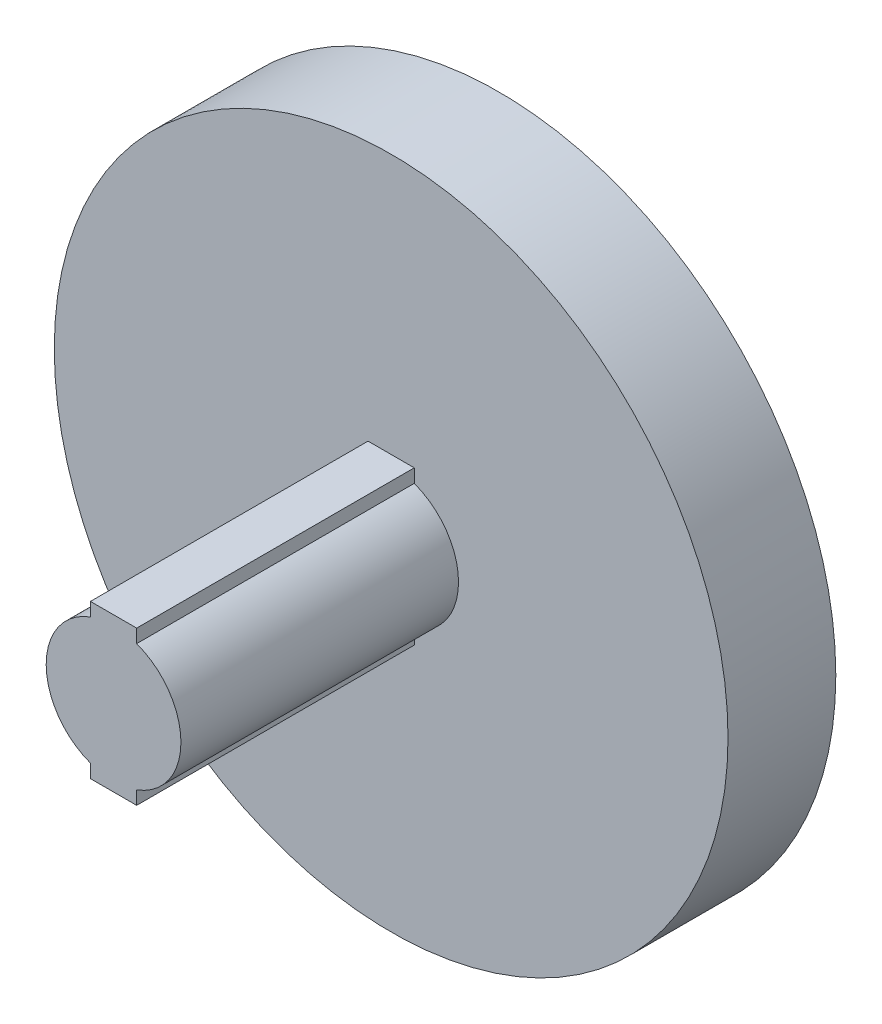
ISO-10303-21;
HEADER;
FILE_DESCRIPTION(('STEP AP214'),'2;1');
FILE_NAME('part.step','',(''),(''),'','','');
FILE_SCHEMA(('AUTOMOTIVE_DESIGN { 1 0 10303 214 1 1 1 1 }'));
ENDSEC;
DATA;
#1=APPLICATION_CONTEXT('core data for automotive mechanical design processes');
#2=APPLICATION_PROTOCOL_DEFINITION('international standard','automotive_design',2000,#1);
#3=PRODUCT_CONTEXT('',#1,'mechanical');
#4=PRODUCT('Part','Part','',(#3));
#5=PRODUCT_RELATED_PRODUCT_CATEGORY('part','',(#4));
#6=PRODUCT_DEFINITION_FORMATION('','',#4);
#7=PRODUCT_DEFINITION_CONTEXT('part definition',#1,'design');
#8=PRODUCT_DEFINITION('design','',#6,#7);
#9=PRODUCT_DEFINITION_SHAPE('','',#8);
#10=(LENGTH_UNIT() NAMED_UNIT(*) SI_UNIT(.MILLI.,.METRE.));
#11=(NAMED_UNIT(*) PLANE_ANGLE_UNIT() SI_UNIT($,.RADIAN.));
#12=(NAMED_UNIT(*) SI_UNIT($,.STERADIAN.) SOLID_ANGLE_UNIT());
#13=UNCERTAINTY_MEASURE_WITH_UNIT(LENGTH_MEASURE(1.E-05),#10,'distance_accuracy_value','');
#14=(GEOMETRIC_REPRESENTATION_CONTEXT(3) GLOBAL_UNCERTAINTY_ASSIGNED_CONTEXT((#13)) GLOBAL_UNIT_ASSIGNED_CONTEXT((#10,
#11,#12)) REPRESENTATION_CONTEXT('',''));
#15=CARTESIAN_POINT('',(0.,0.,0.));
#16=DIRECTION('',(0.,0.,1.));
#17=DIRECTION('',(1.,0.,0.));
#18=AXIS2_PLACEMENT_3D('',#15,#16,#17);
#19=CARTESIAN_POINT('',(0.,0.,8.));
#20=DIRECTION('',(0.,0.,-1.));
#21=DIRECTION('',(-1.,0.,0.));
#22=AXIS2_PLACEMENT_3D('',#19,#20,#21);
#23=CYLINDRICAL_SURFACE('',#22,25.);
#24=CARTESIAN_POINT('',(0.,0.,8.));
#25=DIRECTION('',(0.,0.,1.));
#26=DIRECTION('',(1.,0.,0.));
#27=AXIS2_PLACEMENT_3D('',#24,#25,#26);
#28=CIRCLE('',#27,25.);
#29=CARTESIAN_POINT('',(25.,0.,8.));
#30=VERTEX_POINT('',#29);
#31=EDGE_CURVE('E11',#30,#30,#28,.T.);
#32=ORIENTED_EDGE('',*,*,#31,.F.);
#33=EDGE_LOOP('',(#32));
#34=FACE_BOUND('',#33,.T.);
#35=CARTESIAN_POINT('',(0.,0.,0.));
#36=DIRECTION('',(0.,0.,1.));
#37=DIRECTION('',(1.,0.,0.));
#38=AXIS2_PLACEMENT_3D('',#35,#36,#37);
#39=CIRCLE('',#38,25.);
#40=CARTESIAN_POINT('',(25.,0.,0.));
#41=VERTEX_POINT('',#40);
#42=EDGE_CURVE('E50',#41,#41,#39,.T.);
#43=ORIENTED_EDGE('',*,*,#42,.T.);
#44=EDGE_LOOP('',(#43));
#45=FACE_BOUND('',#44,.T.);
#46=ADVANCED_FACE('F47',(#34,#45),#23,.T.);
#47=CARTESIAN_POINT('',(0.,0.,8.));
#48=DIRECTION('',(0.,0.,1.));
#49=DIRECTION('',(1.,0.,0.));
#50=AXIS2_PLACEMENT_3D('',#47,#48,#49);
#51=PLANE('',#50);
#52=DIRECTION('',(0.,1.,0.));
#53=VECTOR('',#52,1.);
#54=CARTESIAN_POINT('',(1.71514380093522,-5.69662450512211,8.));
#55=LINE('',#54,#53);
#56=CARTESIAN_POINT('',(1.71514380093522,-5.69662450512211,8.));
#57=VERTEX_POINT('',#56);
#58=CARTESIAN_POINT('',(1.71514380093521,-4.69662450512211,8.));
#59=VERTEX_POINT('',#58);
#60=EDGE_CURVE('E62',#57,#59,#55,.T.);
#61=ORIENTED_EDGE('',*,*,#60,.F.);
#62=DIRECTION('',(1.,0.,0.));
#63=VECTOR('',#62,1.);
#64=CARTESIAN_POINT('',(-1.71514380093522,-5.69662450512211,8.));
#65=LINE('',#64,#63);
#66=CARTESIAN_POINT('',(-1.71514380093522,-5.69662450512211,8.));
#67=VERTEX_POINT('',#66);
#68=EDGE_CURVE('E66',#67,#57,#65,.T.);
#69=ORIENTED_EDGE('',*,*,#68,.F.);
#70=DIRECTION('',(0.,1.,0.));
#71=VECTOR('',#70,1.);
#72=CARTESIAN_POINT('',(-1.71514380093522,-5.69662450512211,8.));
#73=LINE('',#72,#71);
#74=CARTESIAN_POINT('',(-1.71514380093522,-4.69662450512211,8.));
#75=VERTEX_POINT('',#74);
#76=EDGE_CURVE('E166',#67,#75,#73,.T.);
#77=ORIENTED_EDGE('',*,*,#76,.T.);
#78=CARTESIAN_POINT('',(0.,0.,8.));
#79=DIRECTION('',(0.,0.,1.));
#80=DIRECTION('',(1.,0.,0.));
#81=AXIS2_PLACEMENT_3D('',#78,#79,#80);
#82=CIRCLE('',#81,5.);
#83=CARTESIAN_POINT('',(-1.71514380093522,4.69662450512211,8.));
#84=VERTEX_POINT('',#83);
#85=EDGE_CURVE('E169',#84,#75,#82,.T.);
#86=ORIENTED_EDGE('',*,*,#85,.F.);
#87=DIRECTION('',(0.,1.,0.));
#88=VECTOR('',#87,1.);
#89=CARTESIAN_POINT('',(-1.71514380093522,4.69662450512211,8.));
#90=LINE('',#89,#88);
#91=CARTESIAN_POINT('',(-1.71514380093522,5.69662450512211,8.));
#92=VERTEX_POINT('',#91);
#93=EDGE_CURVE('E173',#84,#92,#90,.T.);
#94=ORIENTED_EDGE('',*,*,#93,.T.);
#95=DIRECTION('',(1.,0.,0.));
#96=VECTOR('',#95,1.);
#97=CARTESIAN_POINT('',(-1.71514380093522,5.69662450512211,8.));
#98=LINE('',#97,#96);
#99=CARTESIAN_POINT('',(1.71514380093522,5.69662450512211,8.));
#100=VERTEX_POINT('',#99);
#101=EDGE_CURVE('E176',#92,#100,#98,.T.);
#102=ORIENTED_EDGE('',*,*,#101,.T.);
#103=DIRECTION('',(0.,1.,0.));
#104=VECTOR('',#103,1.);
#105=CARTESIAN_POINT('',(1.71514380093522,4.69662450512211,8.));
#106=LINE('',#105,#104);
#107=CARTESIAN_POINT('',(1.71514380093521,4.69662450512211,8.));
#108=VERTEX_POINT('',#107);
#109=EDGE_CURVE('E179',#108,#100,#106,.T.);
#110=ORIENTED_EDGE('',*,*,#109,.F.);
#111=CARTESIAN_POINT('',(0.,0.,8.));
#112=DIRECTION('',(0.,0.,1.));
#113=DIRECTION('',(1.,0.,0.));
#114=AXIS2_PLACEMENT_3D('',#111,#112,#113);
#115=CIRCLE('',#114,5.);
#116=EDGE_CURVE('E183',#59,#108,#115,.T.);
#117=ORIENTED_EDGE('',*,*,#116,.F.);
#118=EDGE_LOOP('',(#61,#69,#77,#86,#94,#102,#110,#117));
#119=FACE_BOUND('',#118,.T.);
#120=ORIENTED_EDGE('',*,*,#31,.T.);
#121=EDGE_LOOP('',(#120));
#122=FACE_BOUND('',#121,.T.);
#123=ADVANCED_FACE('F235',(#119,#122),#51,.T.);
#124=CARTESIAN_POINT('',(0.,0.,0.));
#125=DIRECTION('',(0.,0.,1.));
#126=DIRECTION('',(1.,0.,0.));
#127=AXIS2_PLACEMENT_3D('',#124,#125,#126);
#128=PLANE('',#127);
#129=ORIENTED_EDGE('',*,*,#42,.F.);
#130=EDGE_LOOP('',(#129));
#131=FACE_BOUND('',#130,.T.);
#132=ADVANCED_FACE('F241',(#131),#128,.F.);
#133=CARTESIAN_POINT('',(1.71514380093522,-5.69662450512211,28.6));
#134=DIRECTION('',(-1.,0.,0.));
#135=DIRECTION('',(0.,0.,1.));
#136=AXIS2_PLACEMENT_3D('',#133,#134,#135);
#137=PLANE('',#136);
#138=ORIENTED_EDGE('',*,*,#60,.T.);
#139=DIRECTION('',(0.,0.,-1.));
#140=VECTOR('',#139,1.);
#141=CARTESIAN_POINT('',(1.71514380093521,-4.69662450512211,28.6));
#142=LINE('',#141,#140);
#143=CARTESIAN_POINT('',(1.71514380093521,-4.69662450512211,28.6));
#144=VERTEX_POINT('',#143);
#145=EDGE_CURVE('E115',#144,#59,#142,.T.);
#146=ORIENTED_EDGE('',*,*,#145,.F.);
#147=DIRECTION('',(0.,1.,0.));
#148=VECTOR('',#147,1.);
#149=CARTESIAN_POINT('',(1.71514380093522,-5.69662450512211,28.6));
#150=LINE('',#149,#148);
#151=CARTESIAN_POINT('',(1.71514380093522,-5.69662450512211,28.6));
#152=VERTEX_POINT('',#151);
#153=EDGE_CURVE('E122',#152,#144,#150,.T.);
#154=ORIENTED_EDGE('',*,*,#153,.F.);
#155=DIRECTION('',(0.,0.,-1.));
#156=VECTOR('',#155,1.);
#157=CARTESIAN_POINT('',(1.71514380093522,-5.69662450512211,28.6));
#158=LINE('',#157,#156);
#159=EDGE_CURVE('E161',#152,#57,#158,.T.);
#160=ORIENTED_EDGE('',*,*,#159,.T.);
#161=EDGE_LOOP('',(#138,#146,#154,#160));
#162=FACE_BOUND('',#161,.T.);
#163=ADVANCED_FACE('F134',(#162),#137,.F.);
#164=CARTESIAN_POINT('',(0.,0.,28.6));
#165=DIRECTION('',(0.,0.,-1.));
#166=DIRECTION('',(-1.,0.,0.));
#167=AXIS2_PLACEMENT_3D('',#164,#165,#166);
#168=CYLINDRICAL_SURFACE('',#167,5.);
#169=ORIENTED_EDGE('',*,*,#116,.T.);
#170=DIRECTION('',(0.,0.,-1.));
#171=VECTOR('',#170,1.);
#172=CARTESIAN_POINT('',(1.71514380093521,4.69662450512211,28.6));
#173=LINE('',#172,#171);
#174=CARTESIAN_POINT('',(1.71514380093521,4.69662450512211,28.6));
#175=VERTEX_POINT('',#174);
#176=EDGE_CURVE('E117',#175,#108,#173,.T.);
#177=ORIENTED_EDGE('',*,*,#176,.F.);
#178=CARTESIAN_POINT('',(0.,0.,28.6));
#179=DIRECTION('',(0.,0.,1.));
#180=DIRECTION('',(1.,0.,0.));
#181=AXIS2_PLACEMENT_3D('',#178,#179,#180);
#182=CIRCLE('',#181,5.);
#183=EDGE_CURVE('E110',#144,#175,#182,.T.);
#184=ORIENTED_EDGE('',*,*,#183,.F.);
#185=ORIENTED_EDGE('',*,*,#145,.T.);
#186=EDGE_LOOP('',(#169,#177,#184,#185));
#187=FACE_BOUND('',#186,.T.);
#188=ADVANCED_FACE('F113',(#187),#168,.T.);
#189=CARTESIAN_POINT('',(1.71514380093522,4.69662450512211,28.6));
#190=DIRECTION('',(-1.,0.,0.));
#191=DIRECTION('',(0.,0.,1.));
#192=AXIS2_PLACEMENT_3D('',#189,#190,#191);
#193=PLANE('',#192);
#194=ORIENTED_EDGE('',*,*,#109,.T.);
#195=DIRECTION('',(0.,0.,-1.));
#196=VECTOR('',#195,1.);
#197=CARTESIAN_POINT('',(1.71514380093522,5.69662450512211,28.6));
#198=LINE('',#197,#196);
#199=CARTESIAN_POINT('',(1.71514380093522,5.69662450512211,28.6));
#200=VERTEX_POINT('',#199);
#201=EDGE_CURVE('E140',#200,#100,#198,.T.);
#202=ORIENTED_EDGE('',*,*,#201,.F.);
#203=DIRECTION('',(0.,1.,0.));
#204=VECTOR('',#203,1.);
#205=CARTESIAN_POINT('',(1.71514380093522,4.69662450512211,28.6));
#206=LINE('',#205,#204);
#207=EDGE_CURVE('E121',#175,#200,#206,.T.);
#208=ORIENTED_EDGE('',*,*,#207,.F.);
#209=ORIENTED_EDGE('',*,*,#176,.T.);
#210=EDGE_LOOP('',(#194,#202,#208,#209));
#211=FACE_BOUND('',#210,.T.);
#212=ADVANCED_FACE('F210',(#211),#193,.F.);
#213=CARTESIAN_POINT('',(-1.71514380093522,5.69662450512211,28.6));
#214=DIRECTION('',(0.,1.,0.));
#215=DIRECTION('',(0.,0.,1.));
#216=AXIS2_PLACEMENT_3D('',#213,#214,#215);
#217=PLANE('',#216);
#218=ORIENTED_EDGE('',*,*,#101,.F.);
#219=DIRECTION('',(0.,0.,-1.));
#220=VECTOR('',#219,1.);
#221=CARTESIAN_POINT('',(-1.71514380093522,5.69662450512211,28.6));
#222=LINE('',#221,#220);
#223=CARTESIAN_POINT('',(-1.71514380093522,5.69662450512211,28.6));
#224=VERTEX_POINT('',#223);
#225=EDGE_CURVE('E146',#224,#92,#222,.T.);
#226=ORIENTED_EDGE('',*,*,#225,.F.);
#227=DIRECTION('',(1.,0.,0.));
#228=VECTOR('',#227,1.);
#229=CARTESIAN_POINT('',(-1.71514380093522,5.69662450512211,28.6));
#230=LINE('',#229,#228);
#231=EDGE_CURVE('E201',#224,#200,#230,.T.);
#232=ORIENTED_EDGE('',*,*,#231,.T.);
#233=ORIENTED_EDGE('',*,*,#201,.T.);
#234=EDGE_LOOP('',(#218,#226,#232,#233));
#235=FACE_BOUND('',#234,.T.);
#236=ADVANCED_FACE('F213',(#235),#217,.T.);
#237=CARTESIAN_POINT('',(-1.71514380093522,4.69662450512211,28.6));
#238=DIRECTION('',(-1.,0.,0.));
#239=DIRECTION('',(0.,-1.,0.));
#240=AXIS2_PLACEMENT_3D('',#237,#238,#239);
#241=PLANE('',#240);
#242=ORIENTED_EDGE('',*,*,#93,.F.);
#243=DIRECTION('',(0.,0.,-1.));
#244=VECTOR('',#243,1.);
#245=CARTESIAN_POINT('',(-1.71514380093522,4.69662450512211,28.6));
#246=LINE('',#245,#244);
#247=CARTESIAN_POINT('',(-1.71514380093522,4.69662450512211,28.6));
#248=VERTEX_POINT('',#247);
#249=EDGE_CURVE('E150',#248,#84,#246,.T.);
#250=ORIENTED_EDGE('',*,*,#249,.F.);
#251=DIRECTION('',(0.,1.,0.));
#252=VECTOR('',#251,1.);
#253=CARTESIAN_POINT('',(-1.71514380093522,4.69662450512211,28.6));
#254=LINE('',#253,#252);
#255=EDGE_CURVE('E197',#248,#224,#254,.T.);
#256=ORIENTED_EDGE('',*,*,#255,.T.);
#257=ORIENTED_EDGE('',*,*,#225,.T.);
#258=EDGE_LOOP('',(#242,#250,#256,#257));
#259=FACE_BOUND('',#258,.T.);
#260=ADVANCED_FACE('F216',(#259),#241,.T.);
#261=CARTESIAN_POINT('',(0.,0.,28.6));
#262=DIRECTION('',(0.,0.,-1.));
#263=DIRECTION('',(-1.,0.,0.));
#264=AXIS2_PLACEMENT_3D('',#261,#262,#263);
#265=CYLINDRICAL_SURFACE('',#264,5.);
#266=ORIENTED_EDGE('',*,*,#85,.T.);
#267=DIRECTION('',(0.,0.,-1.));
#268=VECTOR('',#267,1.);
#269=CARTESIAN_POINT('',(-1.71514380093522,-4.69662450512211,28.6));
#270=LINE('',#269,#268);
#271=CARTESIAN_POINT('',(-1.71514380093522,-4.69662450512211,28.6));
#272=VERTEX_POINT('',#271);
#273=EDGE_CURVE('E154',#272,#75,#270,.T.);
#274=ORIENTED_EDGE('',*,*,#273,.F.);
#275=CARTESIAN_POINT('',(0.,0.,28.6));
#276=DIRECTION('',(0.,0.,1.));
#277=DIRECTION('',(1.,0.,0.));
#278=AXIS2_PLACEMENT_3D('',#275,#276,#277);
#279=CIRCLE('',#278,5.);
#280=EDGE_CURVE('E194',#248,#272,#279,.T.);
#281=ORIENTED_EDGE('',*,*,#280,.F.);
#282=ORIENTED_EDGE('',*,*,#249,.T.);
#283=EDGE_LOOP('',(#266,#274,#281,#282));
#284=FACE_BOUND('',#283,.T.);
#285=ADVANCED_FACE('F220',(#284),#265,.T.);
#286=CARTESIAN_POINT('',(-1.71514380093522,-5.69662450512211,28.6));
#287=DIRECTION('',(-1.,0.,0.));
#288=DIRECTION('',(0.,-1.,0.));
#289=AXIS2_PLACEMENT_3D('',#286,#287,#288);
#290=PLANE('',#289);
#291=ORIENTED_EDGE('',*,*,#76,.F.);
#292=DIRECTION('',(0.,0.,-1.));
#293=VECTOR('',#292,1.);
#294=CARTESIAN_POINT('',(-1.71514380093522,-5.69662450512211,28.6));
#295=LINE('',#294,#293);
#296=CARTESIAN_POINT('',(-1.71514380093522,-5.69662450512211,28.6));
#297=VERTEX_POINT('',#296);
#298=EDGE_CURVE('E158',#297,#67,#295,.T.);
#299=ORIENTED_EDGE('',*,*,#298,.F.);
#300=DIRECTION('',(0.,1.,0.));
#301=VECTOR('',#300,1.);
#302=CARTESIAN_POINT('',(-1.71514380093522,-5.69662450512211,28.6));
#303=LINE('',#302,#301);
#304=EDGE_CURVE('E190',#297,#272,#303,.T.);
#305=ORIENTED_EDGE('',*,*,#304,.T.);
#306=ORIENTED_EDGE('',*,*,#273,.T.);
#307=EDGE_LOOP('',(#291,#299,#305,#306));
#308=FACE_BOUND('',#307,.T.);
#309=ADVANCED_FACE('F223',(#308),#290,.T.);
#310=CARTESIAN_POINT('',(-1.71514380093522,-5.69662450512211,28.6));
#311=DIRECTION('',(0.,1.,0.));
#312=DIRECTION('',(0.,0.,1.));
#313=AXIS2_PLACEMENT_3D('',#310,#311,#312);
#314=PLANE('',#313);
#315=ORIENTED_EDGE('',*,*,#68,.T.);
#316=ORIENTED_EDGE('',*,*,#159,.F.);
#317=DIRECTION('',(1.,0.,0.));
#318=VECTOR('',#317,1.);
#319=CARTESIAN_POINT('',(-1.71514380093522,-5.69662450512211,28.6));
#320=LINE('',#319,#318);
#321=EDGE_CURVE('E128',#297,#152,#320,.T.);
#322=ORIENTED_EDGE('',*,*,#321,.F.);
#323=ORIENTED_EDGE('',*,*,#298,.T.);
#324=EDGE_LOOP('',(#315,#316,#322,#323));
#325=FACE_BOUND('',#324,.T.);
#326=ADVANCED_FACE('F225',(#325),#314,.F.);
#327=CARTESIAN_POINT('',(0.,0.,28.6));
#328=DIRECTION('',(0.,0.,1.));
#329=DIRECTION('',(1.,0.,0.));
#330=AXIS2_PLACEMENT_3D('',#327,#328,#329);
#331=PLANE('',#330);
#332=ORIENTED_EDGE('',*,*,#153,.T.);
#333=ORIENTED_EDGE('',*,*,#183,.T.);
#334=ORIENTED_EDGE('',*,*,#207,.T.);
#335=ORIENTED_EDGE('',*,*,#231,.F.);
#336=ORIENTED_EDGE('',*,*,#255,.F.);
#337=ORIENTED_EDGE('',*,*,#280,.T.);
#338=ORIENTED_EDGE('',*,*,#304,.F.);
#339=ORIENTED_EDGE('',*,*,#321,.T.);
#340=EDGE_LOOP('',(#332,#333,#334,#335,#336,#337,#338,#339));
#341=FACE_BOUND('',#340,.T.);
#342=ADVANCED_FACE('F125',(#341),#331,.T.);
#343=CLOSED_SHELL('',(#46,#123,#132,#163,#188,#212,#236,#260,#285,#309,#326,#342));
#344=MANIFOLD_SOLID_BREP('B2',#343);
#345=ADVANCED_BREP_SHAPE_REPRESENTATION('',(#18,#344),#14);
#346=SHAPE_DEFINITION_REPRESENTATION(#9,#345);
ENDSEC;
END-ISO-10303-21;
